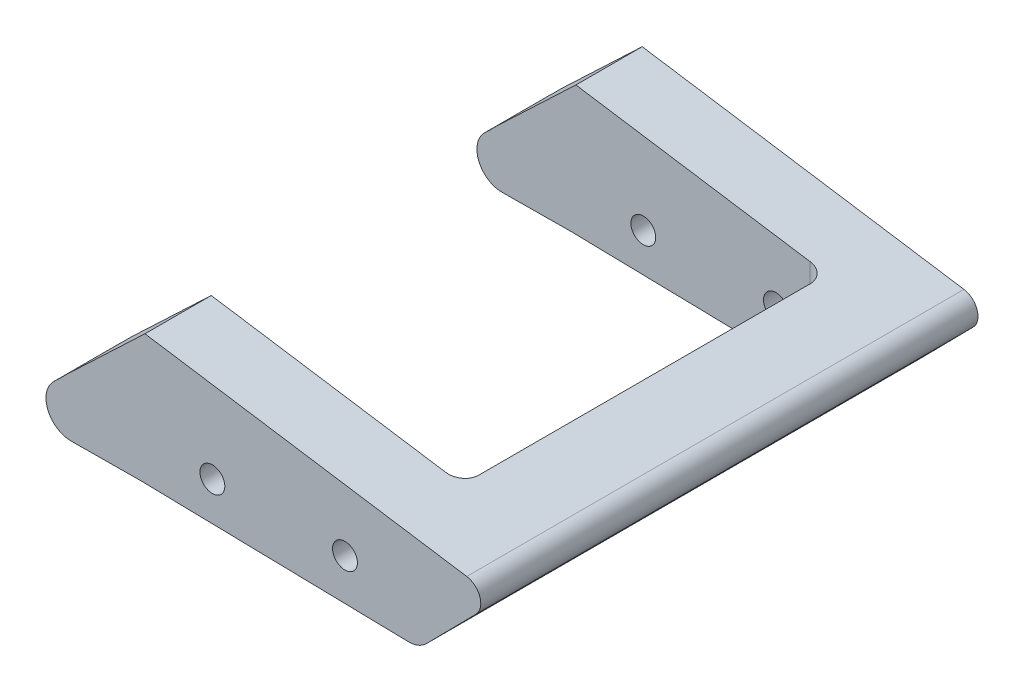
ISO-10303-21;
HEADER;
FILE_DESCRIPTION(('STEP AP214'),'2;1');
FILE_NAME('part.step','',(''),(''),'','','');
FILE_SCHEMA(('AUTOMOTIVE_DESIGN { 1 0 10303 214 1 1 1 1 }'));
ENDSEC;
DATA;
#1=APPLICATION_CONTEXT('core data for automotive mechanical design processes');
#2=APPLICATION_PROTOCOL_DEFINITION('international standard','automotive_design',2000,#1);
#3=PRODUCT_CONTEXT('',#1,'mechanical');
#4=PRODUCT('Part','Part','',(#3));
#5=PRODUCT_RELATED_PRODUCT_CATEGORY('part','',(#4));
#6=PRODUCT_DEFINITION_FORMATION('','',#4);
#7=PRODUCT_DEFINITION_CONTEXT('part definition',#1,'design');
#8=PRODUCT_DEFINITION('design','',#6,#7);
#9=PRODUCT_DEFINITION_SHAPE('','',#8);
#10=(LENGTH_UNIT() NAMED_UNIT(*) SI_UNIT(.MILLI.,.METRE.));
#11=(NAMED_UNIT(*) PLANE_ANGLE_UNIT() SI_UNIT($,.RADIAN.));
#12=(NAMED_UNIT(*) SI_UNIT($,.STERADIAN.) SOLID_ANGLE_UNIT());
#13=UNCERTAINTY_MEASURE_WITH_UNIT(LENGTH_MEASURE(1.E-05),#10,'distance_accuracy_value','');
#14=(GEOMETRIC_REPRESENTATION_CONTEXT(3) GLOBAL_UNCERTAINTY_ASSIGNED_CONTEXT((#13)) GLOBAL_UNIT_ASSIGNED_CONTEXT((#10,
#11,#12)) REPRESENTATION_CONTEXT('',''));
#15=CARTESIAN_POINT('',(0.,0.,0.));
#16=DIRECTION('',(0.,0.,1.));
#17=DIRECTION('',(1.,0.,0.));
#18=AXIS2_PLACEMENT_3D('',#15,#16,#17);
#19=CARTESIAN_POINT('',(0.0316108835593223,-4.36087101256909,117.011279386949));
#20=DIRECTION('',(0.0072485641085957,-0.999973728814094,0.));
#21=DIRECTION('',(0.999973728814094,0.0072485641085957,0.));
#22=AXIS2_PLACEMENT_3D('',#19,#20,#21);
#23=PLANE('',#22);
#24=DIRECTION('',(0.,0.,-1.));
#25=VECTOR('',#24,1.);
#26=CARTESIAN_POINT('',(-16.6770718004308,-4.48198815206506,117.011279386949));
#27=LINE('',#26,#25);
#28=CARTESIAN_POINT('',(-16.6770718004308,-4.48198815206506,8.00000000000001));
#29=VERTEX_POINT('',#28);
#30=CARTESIAN_POINT('',(-16.6770718004308,-4.48198815206506,0.));
#31=VERTEX_POINT('',#30);
#32=EDGE_CURVE('E212',#29,#31,#27,.T.);
#33=ORIENTED_EDGE('',*,*,#32,.F.);
#34=DIRECTION('',(-0.999973728814094,-0.0072485641085957,0.));
#35=VECTOR('',#34,1.);
#36=CARTESIAN_POINT('',(0.0316108835593223,-4.36087101256909,8.00000000000001));
#37=LINE('',#36,#35);
#38=CARTESIAN_POINT('',(-25.0549544316215,-4.54271736684003,8.00000000000001));
#39=VERTEX_POINT('',#38);
#40=EDGE_CURVE('E321',#29,#39,#37,.T.);
#41=ORIENTED_EDGE('',*,*,#40,.T.);
#42=DIRECTION('',(0.,0.,-1.));
#43=VECTOR('',#42,1.);
#44=CARTESIAN_POINT('',(-25.0549544316215,-4.54271736684003,117.011279386949));
#45=LINE('',#44,#43);
#46=CARTESIAN_POINT('',(-25.0549544316215,-4.54271736684003,0.));
#47=VERTEX_POINT('',#46);
#48=EDGE_CURVE('E208',#39,#47,#45,.T.);
#49=ORIENTED_EDGE('',*,*,#48,.T.);
#50=DIRECTION('',(-0.999973728814094,-0.0072485641085957,0.));
#51=VECTOR('',#50,1.);
#52=CARTESIAN_POINT('',(0.0316108835593223,-4.36087101256909,0.));
#53=LINE('',#52,#51);
#54=EDGE_CURVE('E302',#31,#47,#53,.T.);
#55=ORIENTED_EDGE('',*,*,#54,.F.);
#56=EDGE_LOOP('',(#33,#41,#49,#55));
#57=FACE_BOUND('',#56,.T.);
#58=ADVANCED_FACE('F41',(#57),#23,.T.);
#59=CARTESIAN_POINT('',(-25.0767001239407,-1.5427961803977,117.011279386949));
#60=DIRECTION('',(0.,0.,-1.));
#61=DIRECTION('',(-1.,0.,0.));
#62=AXIS2_PLACEMENT_3D('',#59,#60,#61);
#63=CYLINDRICAL_SURFACE('',#62,3.);
#64=ORIENTED_EDGE('',*,*,#48,.F.);
#65=CARTESIAN_POINT('',(-25.0767001239407,-1.5427961803977,8.00000000000001));
#66=DIRECTION('',(0.,0.,1.));
#67=DIRECTION('',(1.,0.,0.));
#68=AXIS2_PLACEMENT_3D('',#65,#66,#67);
#69=CIRCLE('',#68,3.);
#70=CARTESIAN_POINT('',(-27.1059335674856,0.666776545695209,8.00000000000001));
#71=VERTEX_POINT('',#70);
#72=EDGE_CURVE('E319',#39,#71,#69,.F.);
#73=ORIENTED_EDGE('',*,*,#72,.T.);
#74=DIRECTION('',(0.,0.,-1.));
#75=VECTOR('',#74,1.);
#76=CARTESIAN_POINT('',(-27.1059335674524,0.666776545659072,117.011279386949));
#77=LINE('',#76,#75);
#78=CARTESIAN_POINT('',(-27.1059335674524,0.666776545659072,0.));
#79=VERTEX_POINT('',#78);
#80=EDGE_CURVE('E204',#71,#79,#77,.T.);
#81=ORIENTED_EDGE('',*,*,#80,.T.);
#82=CARTESIAN_POINT('',(-25.0767001239407,-1.5427961803977,0.));
#83=DIRECTION('',(0.,0.,-1.));
#84=DIRECTION('',(-1.,0.,0.));
#85=AXIS2_PLACEMENT_3D('',#82,#83,#84);
#86=CIRCLE('',#85,3.);
#87=EDGE_CURVE('E305',#47,#79,#86,.T.);
#88=ORIENTED_EDGE('',*,*,#87,.F.);
#89=EDGE_LOOP('',(#64,#73,#81,#88));
#90=FACE_BOUND('',#89,.T.);
#91=ADVANCED_FACE('F386',(#90),#63,.T.);
#92=CARTESIAN_POINT('',(-44.5458532557913,19.6565931243992,117.011279386949));
#93=DIRECTION('',(0.,0.,-1.));
#94=DIRECTION('',(-1.,0.,0.));
#95=AXIS2_PLACEMENT_3D('',#92,#93,#94);
#96=CYLINDRICAL_SURFACE('',#95,25.783016356264);
#97=CARTESIAN_POINT('',(-44.5458532557913,19.6565931243992,8.00000000000001));
#98=DIRECTION('',(0.,0.,1.));
#99=DIRECTION('',(1.,0.,0.));
#100=AXIS2_PLACEMENT_3D('',#97,#98,#99);
#101=CIRCLE('',#100,25.783016356264);
#102=CARTESIAN_POINT('',(-25.7547386386416,2.00275660453791,8.00000000000001));
#103=VERTEX_POINT('',#102);
#104=EDGE_CURVE('E184',#103,#71,#101,.F.);
#105=ORIENTED_EDGE('',*,*,#104,.F.);
#106=DIRECTION('',(0.,0.,-1.));
#107=VECTOR('',#106,1.);
#108=CARTESIAN_POINT('',(-25.7547386386416,2.00275660453791,117.011279386949));
#109=LINE('',#108,#107);
#110=CARTESIAN_POINT('',(-25.7547386386416,2.00275660453791,0.));
#111=VERTEX_POINT('',#110);
#112=EDGE_CURVE('E183',#103,#111,#109,.T.);
#113=ORIENTED_EDGE('',*,*,#112,.T.);
#114=CARTESIAN_POINT('',(-44.5458532557913,19.6565931243992,0.));
#115=DIRECTION('',(0.,0.,-1.));
#116=DIRECTION('',(-1.,0.,0.));
#117=AXIS2_PLACEMENT_3D('',#114,#115,#116);
#118=CIRCLE('',#117,25.783016356264);
#119=EDGE_CURVE('E308',#111,#79,#118,.T.);
#120=ORIENTED_EDGE('',*,*,#119,.T.);
#121=ORIENTED_EDGE('',*,*,#80,.F.);
#122=EDGE_LOOP('',(#105,#113,#120,#121));
#123=FACE_BOUND('',#122,.T.);
#124=ADVANCED_FACE('F317',(#123),#96,.F.);
#125=CARTESIAN_POINT('',(-13.1967788414368,13.9136738629979,117.011279386949));
#126=DIRECTION('',(-0.68816784766444,0.725551523629365,0.));
#127=DIRECTION('',(-0.725551523629365,-0.68816784766444,0.));
#128=AXIS2_PLACEMENT_3D('',#125,#126,#127);
#129=PLANE('',#128);
#130=ORIENTED_EDGE('',*,*,#112,.F.);
#131=DIRECTION('',(0.725551523629365,0.68816784766444,0.));
#132=VECTOR('',#131,1.);
#133=CARTESIAN_POINT('',(-13.1967788414368,13.9136738629979,8.00000000000001));
#134=LINE('',#133,#132);
#135=CARTESIAN_POINT('',(-16.1370093013055,11.1249372932173,8.00000000000001));
#136=VERTEX_POINT('',#135);
#137=EDGE_CURVE('E168',#103,#136,#134,.T.);
#138=ORIENTED_EDGE('',*,*,#137,.T.);
#139=DIRECTION('',(0.,0.,-1.));
#140=VECTOR('',#139,1.);
#141=CARTESIAN_POINT('',(-16.1370093013055,11.1249372932173,117.011279386949));
#142=LINE('',#141,#140);
#143=CARTESIAN_POINT('',(-16.1370093013055,11.1249372932173,0.));
#144=VERTEX_POINT('',#143);
#145=EDGE_CURVE('E181',#136,#144,#142,.T.);
#146=ORIENTED_EDGE('',*,*,#145,.T.);
#147=DIRECTION('',(0.725551523629365,0.68816784766444,0.));
#148=VECTOR('',#147,1.);
#149=CARTESIAN_POINT('',(-13.1967788414368,13.9136738629979,0.));
#150=LINE('',#149,#148);
#151=EDGE_CURVE('E310',#111,#144,#150,.T.);
#152=ORIENTED_EDGE('',*,*,#151,.F.);
#153=EDGE_LOOP('',(#130,#138,#146,#152));
#154=FACE_BOUND('',#153,.T.);
#155=ADVANCED_FACE('F179',(#154),#129,.T.);
#156=CARTESIAN_POINT('',(-0.101620305707318,-4.83067685524382,117.011279386949));
#157=DIRECTION('',(-0.0210317996992273,-0.999778807237587,0.));
#158=DIRECTION('',(0.999778807237587,-0.0210317996992273,0.));
#159=AXIS2_PLACEMENT_3D('',#156,#157,#158);
#160=PLANE('',#159);
#161=DIRECTION('',(0.999778807237605,-0.0210317996983779,0.));
#162=VECTOR('',#161,1.);
#163=CARTESIAN_POINT('',(-14.0985236070338,-4.53623165946653,8.));
#164=LINE('',#163,#162);
#165=CARTESIAN_POINT('',(11.8957253811439,-5.08305845162436,8.));
#166=VERTEX_POINT('',#165);
#167=EDGE_CURVE('E334',#29,#166,#164,.T.);
#168=ORIENTED_EDGE('',*,*,#167,.F.);
#169=ORIENTED_EDGE('',*,*,#32,.T.);
#170=DIRECTION('',(-0.999778807237587,0.0210317996992273,0.));
#171=VECTOR('',#170,1.);
#172=CARTESIAN_POINT('',(-0.101620305707318,-4.83067685524382,0.));
#173=LINE('',#172,#171);
#174=CARTESIAN_POINT('',(15.6341727645798,-5.16170212360013,0.));
#175=VERTEX_POINT('',#174);
#176=EDGE_CURVE('E299',#175,#31,#173,.T.);
#177=ORIENTED_EDGE('',*,*,#176,.F.);
#178=DIRECTION('',(0.,0.,-1.));
#179=VECTOR('',#178,1.);
#180=CARTESIAN_POINT('',(15.6341727645798,-5.16170212360013,117.011279386949));
#181=LINE('',#180,#179);
#182=CARTESIAN_POINT('',(15.6341727645798,-5.16170212360013,60.));
#183=VERTEX_POINT('',#182);
#184=EDGE_CURVE('E213',#183,#175,#181,.T.);
#185=ORIENTED_EDGE('',*,*,#184,.F.);
#186=DIRECTION('',(-0.999778807237587,0.0210317996992273,0.));
#187=VECTOR('',#186,1.);
#188=CARTESIAN_POINT('',(-0.101620305707318,-4.83067685524382,60.));
#189=LINE('',#188,#187);
#190=CARTESIAN_POINT('',(-16.6770718004308,-4.48198815206506,60.));
#191=VERTEX_POINT('',#190);
#192=EDGE_CURVE('E348',#183,#191,#189,.T.);
#193=ORIENTED_EDGE('',*,*,#192,.T.);
#194=CARTESIAN_POINT('',(-16.6770718004308,-4.48198815206506,52.));
#195=VERTEX_POINT('',#194);
#196=EDGE_CURVE('E209',#191,#195,#27,.T.);
#197=ORIENTED_EDGE('',*,*,#196,.T.);
#198=DIRECTION('',(-0.999778807237605,0.0210317996983779,0.));
#199=VECTOR('',#198,1.);
#200=CARTESIAN_POINT('',(-14.0985236070338,-4.53623165946653,52.));
#201=LINE('',#200,#199);
#202=CARTESIAN_POINT('',(11.8957253811439,-5.08305845162436,52.));
#203=VERTEX_POINT('',#202);
#204=EDGE_CURVE('E260',#203,#195,#201,.T.);
#205=ORIENTED_EDGE('',*,*,#204,.F.);
#206=CARTESIAN_POINT('',(11.8957253811437,-5.08305845163455,50.));
#207=DIRECTION('',(-0.0210317996992273,-0.999778807237587,0.));
#208=DIRECTION('',(0.999778807237587,-0.0210317996992273,0.));
#209=AXIS2_PLACEMENT_3D('',#206,#207,#208);
#210=CIRCLE('',#209,2.);
#211=CARTESIAN_POINT('',(13.8952829956191,-5.12512205102111,50.));
#212=VERTEX_POINT('',#211);
#213=EDGE_CURVE('E49',#203,#212,#210,.F.);
#214=ORIENTED_EDGE('',*,*,#213,.T.);
#215=DIRECTION('',(0.,0.,1.));
#216=VECTOR('',#215,1.);
#217=CARTESIAN_POINT('',(13.8952829956191,-5.12512205102111,8.));
#218=LINE('',#217,#216);
#219=CARTESIAN_POINT('',(13.8952829956191,-5.12512205102111,10.));
#220=VERTEX_POINT('',#219);
#221=EDGE_CURVE('E259',#220,#212,#218,.T.);
#222=ORIENTED_EDGE('',*,*,#221,.F.);
#223=CARTESIAN_POINT('',(11.8957253811437,-5.08305845163455,10.));
#224=DIRECTION('',(-0.0210317996992273,-0.999778807237587,0.));
#225=DIRECTION('',(0.999778807237587,-0.0210317996992273,0.));
#226=AXIS2_PLACEMENT_3D('',#223,#224,#225);
#227=CIRCLE('',#226,2.);
#228=EDGE_CURVE('E250',#220,#166,#227,.F.);
#229=ORIENTED_EDGE('',*,*,#228,.T.);
#230=EDGE_LOOP('',(#168,#169,#177,#185,#193,#197,#205,#214,#222,#229));
#231=FACE_BOUND('',#230,.T.);
#232=ADVANCED_FACE('F258',(#231),#160,.T.);
#233=CARTESIAN_POINT('',(1.29522739605743,8.45424092317582,117.011279386949));
#234=DIRECTION('',(-0.151437524823007,-0.988466831044664,0.));
#235=DIRECTION('',(0.988466831044665,-0.151437524823007,0.));
#236=AXIS2_PLACEMENT_3D('',#233,#234,#235);
#237=PLANE('',#236);
#238=ORIENTED_EDGE('',*,*,#145,.F.);
#239=DIRECTION('',(0.988466831044665,-0.151437524823007,0.));
#240=VECTOR('',#239,1.);
#241=CARTESIAN_POINT('',(1.29522739605743,8.45424092317582,8.00000000000001));
#242=LINE('',#241,#240);
#243=CARTESIAN_POINT('',(12.1455329258811,6.79192574839821,8.00000000000001));
#244=VERTEX_POINT('',#243);
#245=EDGE_CURVE('E164',#136,#244,#242,.T.);
#246=ORIENTED_EDGE('',*,*,#245,.T.);
#247=CARTESIAN_POINT('',(12.1455329258811,6.79192574839821,10.));
#248=DIRECTION('',(-0.151437524823007,-0.988466831044664,0.));
#249=DIRECTION('',(-0.988466831044665,0.151437524823007,0.));
#250=AXIS2_PLACEMENT_3D('',#247,#248,#249);
#251=ELLIPSE('',#250,2.01728166261854,2.);
#252=CARTESIAN_POINT('',(14.1395489382542,6.48643360654042,9.99999999999999));
#253=VERTEX_POINT('',#252);
#254=EDGE_CURVE('E253',#244,#253,#251,.T.);
#255=ORIENTED_EDGE('',*,*,#254,.T.);
#256=DIRECTION('',(0.,0.,1.));
#257=VECTOR('',#256,1.);
#258=CARTESIAN_POINT('',(14.1395489382542,6.48643360654042,117.011279386949));
#259=LINE('',#258,#257);
#260=CARTESIAN_POINT('',(14.1395489382542,6.48643360654042,50.));
#261=VERTEX_POINT('',#260);
#262=EDGE_CURVE('E174',#253,#261,#259,.T.);
#263=ORIENTED_EDGE('',*,*,#262,.T.);
#264=CARTESIAN_POINT('',(12.1455329258811,6.79192574839821,50.));
#265=DIRECTION('',(-0.151437524823007,-0.988466831044664,0.));
#266=DIRECTION('',(-0.988466831044665,0.151437524823007,0.));
#267=AXIS2_PLACEMENT_3D('',#264,#265,#266);
#268=ELLIPSE('',#267,2.01728166261854,2.);
#269=CARTESIAN_POINT('',(12.1455329258811,6.79192574839821,52.));
#270=VERTEX_POINT('',#269);
#271=EDGE_CURVE('E11',#261,#270,#268,.T.);
#272=ORIENTED_EDGE('',*,*,#271,.T.);
#273=DIRECTION('',(-0.988466831044665,0.151437524823007,0.));
#274=VECTOR('',#273,1.);
#275=CARTESIAN_POINT('',(1.29522739605743,8.45424092317582,52.));
#276=LINE('',#275,#274);
#277=CARTESIAN_POINT('',(-16.1370093013055,11.1249372932173,52.));
#278=VERTEX_POINT('',#277);
#279=EDGE_CURVE('E175',#270,#278,#276,.T.);
#280=ORIENTED_EDGE('',*,*,#279,.T.);
#281=CARTESIAN_POINT('',(-16.1370093013055,11.1249372932173,60.));
#282=VERTEX_POINT('',#281);
#283=EDGE_CURVE('E191',#282,#278,#142,.T.);
#284=ORIENTED_EDGE('',*,*,#283,.F.);
#285=DIRECTION('',(-0.988466831044665,0.151437524823007,0.));
#286=VECTOR('',#285,1.);
#287=CARTESIAN_POINT('',(1.29522739605743,8.45424092317582,60.));
#288=LINE('',#287,#286);
#289=CARTESIAN_POINT('',(22.689078911296,5.17660750327175,60.));
#290=VERTEX_POINT('',#289);
#291=EDGE_CURVE('E277',#290,#282,#288,.T.);
#292=ORIENTED_EDGE('',*,*,#291,.F.);
#293=DIRECTION('',(0.,0.,-1.));
#294=VECTOR('',#293,1.);
#295=CARTESIAN_POINT('',(22.689078911296,5.17660750327175,0.));
#296=LINE('',#295,#294);
#297=CARTESIAN_POINT('',(22.689078911296,5.17660750327175,0.));
#298=VERTEX_POINT('',#297);
#299=EDGE_CURVE('E234',#290,#298,#296,.T.);
#300=ORIENTED_EDGE('',*,*,#299,.T.);
#301=DIRECTION('',(-0.988466831044665,0.151437524823007,0.));
#302=VECTOR('',#301,1.);
#303=CARTESIAN_POINT('',(1.29522739605743,8.45424092317582,0.));
#304=LINE('',#303,#302);
#305=EDGE_CURVE('E189',#298,#144,#304,.T.);
#306=ORIENTED_EDGE('',*,*,#305,.T.);
#307=EDGE_LOOP('',(#238,#246,#255,#263,#272,#280,#284,#292,#300,#306));
#308=FACE_BOUND('',#307,.T.);
#309=ADVANCED_FACE('F186',(#308),#237,.F.);
#310=CARTESIAN_POINT('',(-8.,0.,60.));
#311=DIRECTION('',(0.,0.,-1.));
#312=DIRECTION('',(-1.,0.,0.));
#313=AXIS2_PLACEMENT_3D('',#310,#311,#312);
#314=CYLINDRICAL_SURFACE('',#313,1.5);
#315=CARTESIAN_POINT('',(-8.,0.,8.));
#316=DIRECTION('',(0.,0.,-1.));
#317=DIRECTION('',(-1.,0.,0.));
#318=AXIS2_PLACEMENT_3D('',#315,#316,#317);
#319=CIRCLE('',#318,1.5);
#320=CARTESIAN_POINT('',(-9.5,0.,8.));
#321=VERTEX_POINT('',#320);
#322=EDGE_CURVE('E345',#321,#321,#319,.T.);
#323=ORIENTED_EDGE('',*,*,#322,.F.);
#324=EDGE_LOOP('',(#323));
#325=FACE_BOUND('',#324,.T.);
#326=CARTESIAN_POINT('',(-8.,0.,0.));
#327=DIRECTION('',(0.,0.,1.));
#328=DIRECTION('',(1.,0.,0.));
#329=AXIS2_PLACEMENT_3D('',#326,#327,#328);
#330=CIRCLE('',#329,1.5);
#331=CARTESIAN_POINT('',(-6.5,0.,0.));
#332=VERTEX_POINT('',#331);
#333=EDGE_CURVE('E224',#332,#332,#330,.T.);
#334=ORIENTED_EDGE('',*,*,#333,.F.);
#335=EDGE_LOOP('',(#334));
#336=FACE_BOUND('',#335,.T.);
#337=ADVANCED_FACE('F422',(#325,#336),#314,.F.);
#338=CARTESIAN_POINT('',(8.,0.,60.));
#339=DIRECTION('',(0.,0.,-1.));
#340=DIRECTION('',(-1.,0.,0.));
#341=AXIS2_PLACEMENT_3D('',#338,#339,#340);
#342=CYLINDRICAL_SURFACE('',#341,1.5);
#343=CARTESIAN_POINT('',(8.,0.,8.));
#344=DIRECTION('',(0.,0.,-1.));
#345=DIRECTION('',(-1.,0.,0.));
#346=AXIS2_PLACEMENT_3D('',#343,#344,#345);
#347=CIRCLE('',#346,1.5);
#348=CARTESIAN_POINT('',(6.5,0.,8.));
#349=VERTEX_POINT('',#348);
#350=EDGE_CURVE('E342',#349,#349,#347,.T.);
#351=ORIENTED_EDGE('',*,*,#350,.F.);
#352=EDGE_LOOP('',(#351));
#353=FACE_BOUND('',#352,.T.);
#354=CARTESIAN_POINT('',(8.,0.,0.));
#355=DIRECTION('',(0.,0.,1.));
#356=DIRECTION('',(-1.,0.,0.));
#357=AXIS2_PLACEMENT_3D('',#354,#355,#356);
#358=CIRCLE('',#357,1.5);
#359=CARTESIAN_POINT('',(6.5,0.,0.));
#360=VERTEX_POINT('',#359);
#361=EDGE_CURVE('E220',#360,#360,#358,.T.);
#362=ORIENTED_EDGE('',*,*,#361,.F.);
#363=EDGE_LOOP('',(#362));
#364=FACE_BOUND('',#363,.T.);
#365=ADVANCED_FACE('F415',(#353,#364),#342,.F.);
#366=CARTESIAN_POINT('',(0.,0.,60.));
#367=DIRECTION('',(0.,0.,1.));
#368=DIRECTION('',(1.,0.,0.));
#369=AXIS2_PLACEMENT_3D('',#366,#367,#368);
#370=PLANE('',#369);
#371=CARTESIAN_POINT('',(-8.,0.,60.));
#372=DIRECTION('',(0.,0.,1.));
#373=DIRECTION('',(1.,0.,0.));
#374=AXIS2_PLACEMENT_3D('',#371,#372,#373);
#375=CIRCLE('',#374,1.5);
#376=CARTESIAN_POINT('',(-6.5,0.,60.));
#377=VERTEX_POINT('',#376);
#378=EDGE_CURVE('E227',#377,#377,#375,.T.);
#379=ORIENTED_EDGE('',*,*,#378,.F.);
#380=EDGE_LOOP('',(#379));
#381=FACE_BOUND('',#380,.T.);
#382=CARTESIAN_POINT('',(8.,0.,60.));
#383=DIRECTION('',(0.,0.,1.));
#384=DIRECTION('',(-1.,0.,0.));
#385=AXIS2_PLACEMENT_3D('',#382,#383,#384);
#386=CIRCLE('',#385,1.5);
#387=CARTESIAN_POINT('',(6.5,0.,60.));
#388=VERTEX_POINT('',#387);
#389=EDGE_CURVE('E221',#388,#388,#386,.T.);
#390=ORIENTED_EDGE('',*,*,#389,.F.);
#391=EDGE_LOOP('',(#390));
#392=FACE_BOUND('',#391,.T.);
#393=DIRECTION('',(-0.701962695817865,-0.712213713487823,0.));
#394=VECTOR('',#393,1.);
#395=CARTESIAN_POINT('',(11.1801241243222,-11.0192066247286,60.));
#396=LINE('',#395,#394);
#397=CARTESIAN_POINT('',(23.8106312886256,1.79574844954669,60.));
#398=VERTEX_POINT('',#397);
#399=CARTESIAN_POINT('',(17.8339093041352,-4.26825378934536,60.));
#400=VERTEX_POINT('',#399);
#401=EDGE_CURVE('E287',#398,#400,#396,.T.);
#402=ORIENTED_EDGE('',*,*,#401,.F.);
#403=CARTESIAN_POINT('',(22.38620386165,3.19967384118242,60.));
#404=DIRECTION('',(0.,0.,1.));
#405=DIRECTION('',(1.,0.,0.));
#406=AXIS2_PLACEMENT_3D('',#403,#404,#405);
#407=CIRCLE('',#406,2.);
#408=EDGE_CURVE('E240',#398,#290,#407,.T.);
#409=ORIENTED_EDGE('',*,*,#408,.T.);
#410=ORIENTED_EDGE('',*,*,#291,.T.);
#411=DIRECTION('',(0.725551523629365,0.68816784766444,0.));
#412=VECTOR('',#411,1.);
#413=CARTESIAN_POINT('',(-13.1967788414368,13.9136738629979,60.));
#414=LINE('',#413,#412);
#415=CARTESIAN_POINT('',(-25.7547386386058,2.00275660450431,60.));
#416=VERTEX_POINT('',#415);
#417=EDGE_CURVE('E281',#416,#282,#414,.T.);
#418=ORIENTED_EDGE('',*,*,#417,.F.);
#419=CARTESIAN_POINT('',(-44.5458532557913,19.6565931243992,60.));
#420=DIRECTION('',(0.,0.,1.));
#421=DIRECTION('',(1.,0.,0.));
#422=AXIS2_PLACEMENT_3D('',#419,#420,#421);
#423=CIRCLE('',#422,25.783016356264);
#424=CARTESIAN_POINT('',(-27.1059335674524,0.666776545659072,60.));
#425=VERTEX_POINT('',#424);
#426=EDGE_CURVE('E285',#416,#425,#423,.F.);
#427=ORIENTED_EDGE('',*,*,#426,.T.);
#428=CARTESIAN_POINT('',(-25.0767001239407,-1.5427961803977,60.));
#429=DIRECTION('',(0.,0.,1.));
#430=DIRECTION('',(1.,0.,0.));
#431=AXIS2_PLACEMENT_3D('',#428,#429,#430);
#432=CIRCLE('',#431,3.);
#433=CARTESIAN_POINT('',(-25.0549544316215,-4.54271736684003,60.));
#434=VERTEX_POINT('',#433);
#435=EDGE_CURVE('E289',#434,#425,#432,.F.);
#436=ORIENTED_EDGE('',*,*,#435,.F.);
#437=DIRECTION('',(-0.999973728814094,-0.0072485641085957,0.));
#438=VECTOR('',#437,1.);
#439=CARTESIAN_POINT('',(0.0316108835593223,-4.36087101256909,60.));
#440=LINE('',#439,#438);
#441=EDGE_CURVE('E351',#191,#434,#440,.T.);
#442=ORIENTED_EDGE('',*,*,#441,.F.);
#443=ORIENTED_EDGE('',*,*,#192,.F.);
#444=CARTESIAN_POINT('',(15.6972681636761,-2.16236570188734,60.));
#445=DIRECTION('',(0.,0.,1.));
#446=DIRECTION('',(1.,0.,0.));
#447=AXIS2_PLACEMENT_3D('',#444,#445,#446);
#448=CIRCLE('',#447,3.);
#449=EDGE_CURVE('E195',#400,#183,#448,.F.);
#450=ORIENTED_EDGE('',*,*,#449,.F.);
#451=EDGE_LOOP('',(#402,#409,#410,#418,#427,#436,#442,#443,#450));
#452=FACE_BOUND('',#451,.T.);
#453=ADVANCED_FACE('F360',(#381,#392,#452),#370,.T.);
#454=CARTESIAN_POINT('',(0.,0.,0.));
#455=DIRECTION('',(0.,0.,1.));
#456=DIRECTION('',(1.,0.,0.));
#457=AXIS2_PLACEMENT_3D('',#454,#455,#456);
#458=PLANE('',#457);
#459=ORIENTED_EDGE('',*,*,#333,.T.);
#460=EDGE_LOOP('',(#459));
#461=FACE_BOUND('',#460,.T.);
#462=ORIENTED_EDGE('',*,*,#361,.T.);
#463=EDGE_LOOP('',(#462));
#464=FACE_BOUND('',#463,.T.);
#465=ORIENTED_EDGE('',*,*,#305,.F.);
#466=CARTESIAN_POINT('',(22.38620386165,3.19967384118242,0.));
#467=DIRECTION('',(0.,0.,1.));
#468=DIRECTION('',(1.,0.,0.));
#469=AXIS2_PLACEMENT_3D('',#466,#467,#468);
#470=CIRCLE('',#469,2.);
#471=CARTESIAN_POINT('',(23.8106312886256,1.79574844954669,0.));
#472=VERTEX_POINT('',#471);
#473=EDGE_CURVE('E236',#298,#472,#470,.F.);
#474=ORIENTED_EDGE('',*,*,#473,.T.);
#475=DIRECTION('',(-0.701962695817865,-0.712213713487823,0.));
#476=VECTOR('',#475,1.);
#477=CARTESIAN_POINT('',(11.1801241243222,-11.0192066247286,0.));
#478=LINE('',#477,#476);
#479=CARTESIAN_POINT('',(17.8339093041352,-4.26825378934537,0.));
#480=VERTEX_POINT('',#479);
#481=EDGE_CURVE('E294',#472,#480,#478,.T.);
#482=ORIENTED_EDGE('',*,*,#481,.T.);
#483=CARTESIAN_POINT('',(15.6972681636761,-2.16236570188734,0.));
#484=DIRECTION('',(0.,0.,-1.));
#485=DIRECTION('',(-1.,0.,0.));
#486=AXIS2_PLACEMENT_3D('',#483,#484,#485);
#487=CIRCLE('',#486,3.);
#488=EDGE_CURVE('E296',#480,#175,#487,.T.);
#489=ORIENTED_EDGE('',*,*,#488,.T.);
#490=ORIENTED_EDGE('',*,*,#176,.T.);
#491=ORIENTED_EDGE('',*,*,#54,.T.);
#492=ORIENTED_EDGE('',*,*,#87,.T.);
#493=ORIENTED_EDGE('',*,*,#119,.F.);
#494=ORIENTED_EDGE('',*,*,#151,.T.);
#495=EDGE_LOOP('',(#465,#474,#482,#489,#490,#491,#492,#493,#494));
#496=FACE_BOUND('',#495,.T.);
#497=ADVANCED_FACE('F313',(#461,#464,#496),#458,.F.);
#498=CARTESIAN_POINT('',(-8.,0.,52.));
#499=DIRECTION('',(0.,0.,1.));
#500=DIRECTION('',(1.,0.,0.));
#501=AXIS2_PLACEMENT_3D('',#498,#499,#500);
#502=CIRCLE('',#501,1.5);
#503=CARTESIAN_POINT('',(-6.5,0.,52.));
#504=VERTEX_POINT('',#503);
#505=EDGE_CURVE('E339',#504,#504,#502,.T.);
#506=ORIENTED_EDGE('',*,*,#505,.F.);
#507=EDGE_LOOP('',(#506));
#508=FACE_BOUND('',#507,.T.);
#509=ORIENTED_EDGE('',*,*,#378,.T.);
#510=EDGE_LOOP('',(#509));
#511=FACE_BOUND('',#510,.T.);
#512=ADVANCED_FACE('F412',(#508,#511),#314,.F.);
#513=CARTESIAN_POINT('',(8.,0.,52.));
#514=DIRECTION('',(0.,0.,1.));
#515=DIRECTION('',(1.,0.,0.));
#516=AXIS2_PLACEMENT_3D('',#513,#514,#515);
#517=CIRCLE('',#516,1.5);
#518=CARTESIAN_POINT('',(9.5,0.,52.));
#519=VERTEX_POINT('',#518);
#520=EDGE_CURVE('E336',#519,#519,#517,.T.);
#521=ORIENTED_EDGE('',*,*,#520,.F.);
#522=EDGE_LOOP('',(#521));
#523=FACE_BOUND('',#522,.T.);
#524=ORIENTED_EDGE('',*,*,#389,.T.);
#525=EDGE_LOOP('',(#524));
#526=FACE_BOUND('',#525,.T.);
#527=ADVANCED_FACE('F407',(#523,#526),#342,.F.);
#528=CARTESIAN_POINT('',(15.6972681636761,-2.16236570188734,117.011279386949));
#529=DIRECTION('',(0.,0.,-1.));
#530=DIRECTION('',(-1.,0.,0.));
#531=AXIS2_PLACEMENT_3D('',#528,#529,#530);
#532=CYLINDRICAL_SURFACE('',#531,3.);
#533=DIRECTION('',(0.,0.,-1.));
#534=VECTOR('',#533,1.);
#535=CARTESIAN_POINT('',(17.8339093041352,-4.26825378934537,117.011279386949));
#536=LINE('',#535,#534);
#537=EDGE_CURVE('E215',#400,#480,#536,.T.);
#538=ORIENTED_EDGE('',*,*,#537,.F.);
#539=ORIENTED_EDGE('',*,*,#449,.T.);
#540=ORIENTED_EDGE('',*,*,#184,.T.);
#541=ORIENTED_EDGE('',*,*,#488,.F.);
#542=EDGE_LOOP('',(#538,#539,#540,#541));
#543=FACE_BOUND('',#542,.T.);
#544=ADVANCED_FACE('F373',(#543),#532,.T.);
#545=DIRECTION('',(-0.999973728814094,-0.0072485641085957,0.));
#546=VECTOR('',#545,1.);
#547=CARTESIAN_POINT('',(0.0316108835593223,-4.36087101256909,52.));
#548=LINE('',#547,#546);
#549=CARTESIAN_POINT('',(-25.0549544316215,-4.54271736684003,52.));
#550=VERTEX_POINT('',#549);
#551=EDGE_CURVE('E265',#195,#550,#548,.T.);
#552=ORIENTED_EDGE('',*,*,#551,.F.);
#553=ORIENTED_EDGE('',*,*,#196,.F.);
#554=ORIENTED_EDGE('',*,*,#441,.T.);
#555=EDGE_CURVE('E205',#434,#550,#45,.T.);
#556=ORIENTED_EDGE('',*,*,#555,.T.);
#557=EDGE_LOOP('',(#552,#553,#554,#556));
#558=FACE_BOUND('',#557,.T.);
#559=ADVANCED_FACE('F365',(#558),#23,.T.);
#560=CARTESIAN_POINT('',(-25.0767001239407,-1.5427961803977,52.));
#561=DIRECTION('',(0.,0.,1.));
#562=DIRECTION('',(1.,0.,0.));
#563=AXIS2_PLACEMENT_3D('',#560,#561,#562);
#564=CIRCLE('',#563,3.);
#565=CARTESIAN_POINT('',(-27.1059335674856,0.666776545695209,52.));
#566=VERTEX_POINT('',#565);
#567=EDGE_CURVE('E330',#550,#566,#564,.F.);
#568=ORIENTED_EDGE('',*,*,#567,.F.);
#569=ORIENTED_EDGE('',*,*,#555,.F.);
#570=ORIENTED_EDGE('',*,*,#435,.T.);
#571=EDGE_CURVE('E201',#425,#566,#77,.T.);
#572=ORIENTED_EDGE('',*,*,#571,.T.);
#573=EDGE_LOOP('',(#568,#569,#570,#572));
#574=FACE_BOUND('',#573,.T.);
#575=ADVANCED_FACE('F357',(#574),#63,.T.);
#576=CARTESIAN_POINT('',(-25.7547386386416,2.00275660453791,52.));
#577=VERTEX_POINT('',#576);
#578=EDGE_CURVE('E192',#416,#577,#109,.T.);
#579=ORIENTED_EDGE('',*,*,#578,.T.);
#580=CARTESIAN_POINT('',(-44.5458532557913,19.6565931243992,52.));
#581=DIRECTION('',(0.,0.,1.));
#582=DIRECTION('',(1.,0.,0.));
#583=AXIS2_PLACEMENT_3D('',#580,#581,#582);
#584=CIRCLE('',#583,25.783016356264);
#585=EDGE_CURVE('E327',#577,#566,#584,.F.);
#586=ORIENTED_EDGE('',*,*,#585,.T.);
#587=ORIENTED_EDGE('',*,*,#571,.F.);
#588=ORIENTED_EDGE('',*,*,#426,.F.);
#589=EDGE_LOOP('',(#579,#586,#587,#588));
#590=FACE_BOUND('',#589,.T.);
#591=ADVANCED_FACE('F363',(#590),#96,.F.);
#592=DIRECTION('',(0.725551523629365,0.68816784766444,0.));
#593=VECTOR('',#592,1.);
#594=CARTESIAN_POINT('',(-13.1967788414368,13.9136738629979,52.));
#595=LINE('',#594,#593);
#596=EDGE_CURVE('E273',#577,#278,#595,.T.);
#597=ORIENTED_EDGE('',*,*,#596,.F.);
#598=ORIENTED_EDGE('',*,*,#578,.F.);
#599=ORIENTED_EDGE('',*,*,#417,.T.);
#600=ORIENTED_EDGE('',*,*,#283,.T.);
#601=EDGE_LOOP('',(#597,#598,#599,#600));
#602=FACE_BOUND('',#601,.T.);
#603=ADVANCED_FACE('F282',(#602),#129,.T.);
#604=CARTESIAN_POINT('',(11.1801241243222,-11.0192066247286,117.011279386949));
#605=DIRECTION('',(0.712213713487823,-0.701962695817865,0.));
#606=DIRECTION('',(0.701962695817865,0.712213713487823,0.));
#607=AXIS2_PLACEMENT_3D('',#604,#605,#606);
#608=PLANE('',#607);
#609=ORIENTED_EDGE('',*,*,#481,.F.);
#610=DIRECTION('',(0.,0.,-1.));
#611=VECTOR('',#610,1.);
#612=CARTESIAN_POINT('',(23.8106312886256,1.79574844954669,60.));
#613=LINE('',#612,#611);
#614=EDGE_CURVE('E238',#472,#398,#613,.F.);
#615=ORIENTED_EDGE('',*,*,#614,.T.);
#616=ORIENTED_EDGE('',*,*,#401,.T.);
#617=ORIENTED_EDGE('',*,*,#537,.T.);
#618=EDGE_LOOP('',(#609,#615,#616,#617));
#619=FACE_BOUND('',#618,.T.);
#620=ADVANCED_FACE('F376',(#619),#608,.T.);
#621=CARTESIAN_POINT('',(14.2425768153709,11.3840215245121,8.));
#622=DIRECTION('',(0.999778807237605,-0.0210317996983779,0.));
#623=DIRECTION('',(0.0210317996983779,0.999778807237605,0.));
#624=AXIS2_PLACEMENT_3D('',#621,#622,#623);
#625=PLANE('',#624);
#626=ORIENTED_EDGE('',*,*,#262,.F.);
#627=DIRECTION('',(-0.0210317996983779,-0.999778807237605,0.));
#628=VECTOR('',#627,1.);
#629=CARTESIAN_POINT('',(13.8952829956191,-5.12512205102112,10.));
#630=LINE('',#629,#628);
#631=EDGE_CURVE('E245',#253,#220,#630,.T.);
#632=ORIENTED_EDGE('',*,*,#631,.T.);
#633=ORIENTED_EDGE('',*,*,#221,.T.);
#634=DIRECTION('',(-0.0210317996983779,-0.999778807237605,0.));
#635=VECTOR('',#634,1.);
#636=CARTESIAN_POINT('',(14.1395489382542,6.48643360654042,50.));
#637=LINE('',#636,#635);
#638=EDGE_CURVE('E243',#212,#261,#637,.F.);
#639=ORIENTED_EDGE('',*,*,#638,.T.);
#640=EDGE_LOOP('',(#626,#632,#633,#639));
#641=FACE_BOUND('',#640,.T.);
#642=ADVANCED_FACE('F263',(#641),#625,.F.);
#643=CARTESIAN_POINT('',(-13.751229787282,11.9729119160667,8.));
#644=DIRECTION('',(0.,0.,-1.));
#645=DIRECTION('',(-1.,0.,0.));
#646=AXIS2_PLACEMENT_3D('',#643,#644,#645);
#647=PLANE('',#646);
#648=ORIENTED_EDGE('',*,*,#350,.T.);
#649=EDGE_LOOP('',(#648));
#650=FACE_BOUND('',#649,.T.);
#651=DIRECTION('',(-0.0210317996983779,-0.999778807237605,0.));
#652=VECTOR('',#651,1.);
#653=CARTESIAN_POINT('',(12.139991323779,6.52849720593717,8.));
#654=LINE('',#653,#652);
#655=EDGE_CURVE('E171',#166,#244,#654,.F.);
#656=ORIENTED_EDGE('',*,*,#655,.T.);
#657=ORIENTED_EDGE('',*,*,#245,.F.);
#658=ORIENTED_EDGE('',*,*,#137,.F.);
#659=ORIENTED_EDGE('',*,*,#104,.T.);
#660=ORIENTED_EDGE('',*,*,#72,.F.);
#661=ORIENTED_EDGE('',*,*,#40,.F.);
#662=ORIENTED_EDGE('',*,*,#167,.T.);
#663=EDGE_LOOP('',(#656,#657,#658,#659,#660,#661,#662));
#664=FACE_BOUND('',#663,.T.);
#665=ORIENTED_EDGE('',*,*,#322,.T.);
#666=EDGE_LOOP('',(#665));
#667=FACE_BOUND('',#666,.T.);
#668=ADVANCED_FACE('F166',(#650,#664,#667),#647,.F.);
#669=CARTESIAN_POINT('',(-13.751229787282,11.9729119160667,52.));
#670=DIRECTION('',(0.,0.,1.));
#671=DIRECTION('',(1.,0.,0.));
#672=AXIS2_PLACEMENT_3D('',#669,#670,#671);
#673=PLANE('',#672);
#674=ORIENTED_EDGE('',*,*,#279,.F.);
#675=DIRECTION('',(-0.0210317996983779,-0.999778807237605,0.));
#676=VECTOR('',#675,1.);
#677=CARTESIAN_POINT('',(11.8957253811437,-5.08305845163625,52.));
#678=LINE('',#677,#676);
#679=EDGE_CURVE('E248',#270,#203,#678,.T.);
#680=ORIENTED_EDGE('',*,*,#679,.T.);
#681=ORIENTED_EDGE('',*,*,#204,.T.);
#682=ORIENTED_EDGE('',*,*,#551,.T.);
#683=ORIENTED_EDGE('',*,*,#567,.T.);
#684=ORIENTED_EDGE('',*,*,#585,.F.);
#685=ORIENTED_EDGE('',*,*,#596,.T.);
#686=EDGE_LOOP('',(#674,#680,#681,#682,#683,#684,#685));
#687=FACE_BOUND('',#686,.T.);
#688=ORIENTED_EDGE('',*,*,#520,.T.);
#689=EDGE_LOOP('',(#688));
#690=FACE_BOUND('',#689,.T.);
#691=ORIENTED_EDGE('',*,*,#505,.T.);
#692=EDGE_LOOP('',(#691));
#693=FACE_BOUND('',#692,.T.);
#694=ADVANCED_FACE('F268',(#687,#690,#693),#673,.F.);
#695=CARTESIAN_POINT('',(22.38620386165,3.19967384118242,117.011279386949));
#696=DIRECTION('',(0.,0.,1.));
#697=DIRECTION('',(1.,0.,0.));
#698=AXIS2_PLACEMENT_3D('',#695,#696,#697);
#699=CYLINDRICAL_SURFACE('',#698,2.);
#700=ORIENTED_EDGE('',*,*,#408,.F.);
#701=ORIENTED_EDGE('',*,*,#614,.F.);
#702=ORIENTED_EDGE('',*,*,#473,.F.);
#703=ORIENTED_EDGE('',*,*,#299,.F.);
#704=EDGE_LOOP('',(#700,#701,#702,#703));
#705=FACE_BOUND('',#704,.T.);
#706=ADVANCED_FACE('F379',(#705),#699,.T.);
#707=CARTESIAN_POINT('',(12.2430192008957,11.4260851239089,10.));
#708=DIRECTION('',(0.0210317996983779,0.999778807237605,0.));
#709=DIRECTION('',(-0.999778807237605,0.0210317996983779,0.));
#710=AXIS2_PLACEMENT_3D('',#707,#708,#709);
#711=CYLINDRICAL_SURFACE('',#710,2.);
#712=ORIENTED_EDGE('',*,*,#254,.F.);
#713=ORIENTED_EDGE('',*,*,#655,.F.);
#714=ORIENTED_EDGE('',*,*,#228,.F.);
#715=ORIENTED_EDGE('',*,*,#631,.F.);
#716=EDGE_LOOP('',(#712,#713,#714,#715));
#717=FACE_BOUND('',#716,.T.);
#718=ADVANCED_FACE('F388',(#717),#711,.F.);
#719=CARTESIAN_POINT('',(12.2430192008957,11.4260851239089,50.));
#720=DIRECTION('',(0.0210317996983779,0.999778807237605,0.));
#721=DIRECTION('',(-0.999778807237605,0.0210317996983779,0.));
#722=AXIS2_PLACEMENT_3D('',#719,#720,#721);
#723=CYLINDRICAL_SURFACE('',#722,2.);
#724=ORIENTED_EDGE('',*,*,#271,.F.);
#725=ORIENTED_EDGE('',*,*,#638,.F.);
#726=ORIENTED_EDGE('',*,*,#213,.F.);
#727=ORIENTED_EDGE('',*,*,#679,.F.);
#728=EDGE_LOOP('',(#724,#725,#726,#727));
#729=FACE_BOUND('',#728,.T.);
#730=ADVANCED_FACE('F43',(#729),#723,.F.);
#731=CLOSED_SHELL('',(#58,#91,#124,#155,#232,#309,#337,#365,#453,#497,#512,#527,#544,#559,#575,
#591,#603,#620,#642,#668,#694,#706,#718,#730));
#732=MANIFOLD_SOLID_BREP('B2',#731);
#733=ADVANCED_BREP_SHAPE_REPRESENTATION('',(#18,#732),#14);
#734=SHAPE_DEFINITION_REPRESENTATION(#9,#733);
ENDSEC;
END-ISO-10303-21;
